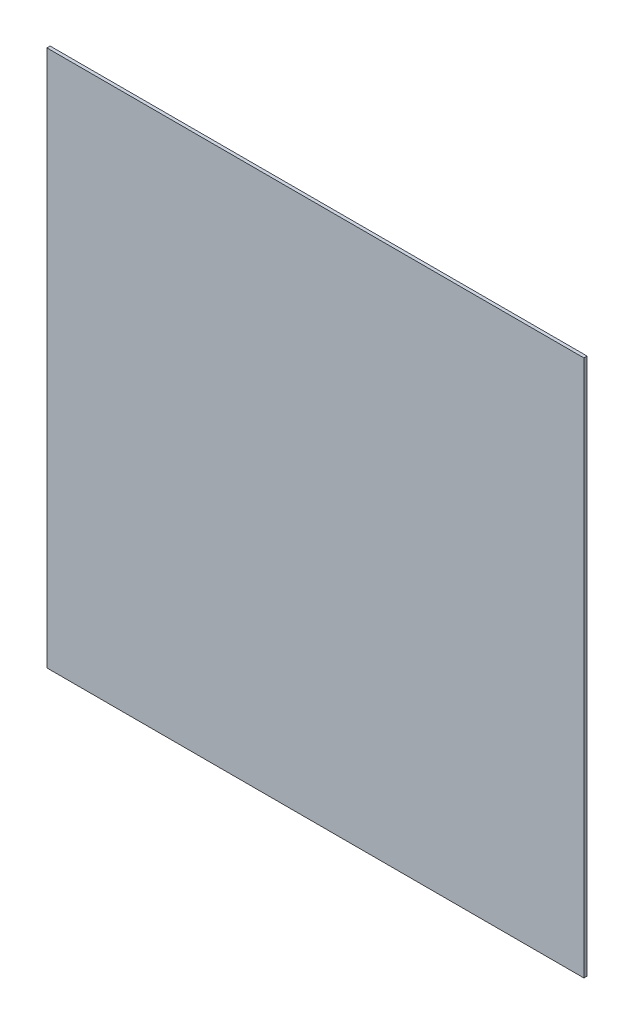
ISO-10303-21;
HEADER;
FILE_DESCRIPTION(('STEP AP214'),'2;1');
FILE_NAME('part.step','',(''),(''),'','','');
FILE_SCHEMA(('AUTOMOTIVE_DESIGN { 1 0 10303 214 1 1 1 1 }'));
ENDSEC;
DATA;
#1=APPLICATION_CONTEXT('core data for automotive mechanical design processes');
#2=APPLICATION_PROTOCOL_DEFINITION('international standard','automotive_design',2000,#1);
#3=PRODUCT_CONTEXT('',#1,'mechanical');
#4=PRODUCT('Part','Part','',(#3));
#5=PRODUCT_RELATED_PRODUCT_CATEGORY('part','',(#4));
#6=PRODUCT_DEFINITION_FORMATION('','',#4);
#7=PRODUCT_DEFINITION_CONTEXT('part definition',#1,'design');
#8=PRODUCT_DEFINITION('design','',#6,#7);
#9=PRODUCT_DEFINITION_SHAPE('','',#8);
#10=(LENGTH_UNIT() NAMED_UNIT(*) SI_UNIT(.MILLI.,.METRE.));
#11=(NAMED_UNIT(*) PLANE_ANGLE_UNIT() SI_UNIT($,.RADIAN.));
#12=(NAMED_UNIT(*) SI_UNIT($,.STERADIAN.) SOLID_ANGLE_UNIT());
#13=UNCERTAINTY_MEASURE_WITH_UNIT(LENGTH_MEASURE(1.E-05),#10,'distance_accuracy_value','');
#14=(GEOMETRIC_REPRESENTATION_CONTEXT(3) GLOBAL_UNCERTAINTY_ASSIGNED_CONTEXT((#13)) GLOBAL_UNIT_ASSIGNED_CONTEXT((#10,
#11,#12)) REPRESENTATION_CONTEXT('',''));
#15=CARTESIAN_POINT('',(0.,0.,0.));
#16=DIRECTION('',(0.,0.,1.));
#17=DIRECTION('',(1.,0.,0.));
#18=AXIS2_PLACEMENT_3D('',#15,#16,#17);
#19=CARTESIAN_POINT('',(250.,250.,3.));
#20=DIRECTION('',(-1.,0.,0.));
#21=DIRECTION('',(0.,0.,1.));
#22=AXIS2_PLACEMENT_3D('',#19,#20,#21);
#23=PLANE('',#22);
#24=DIRECTION('',(0.,1.,0.));
#25=VECTOR('',#24,1.);
#26=CARTESIAN_POINT('',(250.,250.,0.));
#27=LINE('',#26,#25);
#28=CARTESIAN_POINT('',(250.,-250.,0.));
#29=VERTEX_POINT('',#28);
#30=CARTESIAN_POINT('',(250.,250.,0.));
#31=VERTEX_POINT('',#30);
#32=EDGE_CURVE('E102',#29,#31,#27,.T.);
#33=ORIENTED_EDGE('',*,*,#32,.T.);
#34=DIRECTION('',(0.,0.,-1.));
#35=VECTOR('',#34,1.);
#36=CARTESIAN_POINT('',(250.,250.,3.));
#37=LINE('',#36,#35);
#38=CARTESIAN_POINT('',(250.,250.,3.));
#39=VERTEX_POINT('',#38);
#40=EDGE_CURVE('E11',#39,#31,#37,.T.);
#41=ORIENTED_EDGE('',*,*,#40,.F.);
#42=DIRECTION('',(0.,1.,0.));
#43=VECTOR('',#42,1.);
#44=CARTESIAN_POINT('',(250.,250.,3.));
#45=LINE('',#44,#43);
#46=CARTESIAN_POINT('',(250.,-250.,3.));
#47=VERTEX_POINT('',#46);
#48=EDGE_CURVE('E95',#47,#39,#45,.T.);
#49=ORIENTED_EDGE('',*,*,#48,.F.);
#50=DIRECTION('',(0.,0.,-1.));
#51=VECTOR('',#50,1.);
#52=CARTESIAN_POINT('',(250.,-250.,3.));
#53=LINE('',#52,#51);
#54=EDGE_CURVE('E99',#47,#29,#53,.T.);
#55=ORIENTED_EDGE('',*,*,#54,.T.);
#56=EDGE_LOOP('',(#33,#41,#49,#55));
#57=FACE_BOUND('',#56,.T.);
#58=ADVANCED_FACE('F41',(#57),#23,.F.);
#59=CARTESIAN_POINT('',(-250.,250.,3.));
#60=DIRECTION('',(0.,-1.,0.));
#61=DIRECTION('',(0.,0.,-1.));
#62=AXIS2_PLACEMENT_3D('',#59,#60,#61);
#63=PLANE('',#62);
#64=DIRECTION('',(-1.,0.,0.));
#65=VECTOR('',#64,1.);
#66=CARTESIAN_POINT('',(-250.,250.,0.));
#67=LINE('',#66,#65);
#68=CARTESIAN_POINT('',(-250.,250.,0.));
#69=VERTEX_POINT('',#68);
#70=EDGE_CURVE('E96',#31,#69,#67,.T.);
#71=ORIENTED_EDGE('',*,*,#70,.T.);
#72=DIRECTION('',(0.,0.,-1.));
#73=VECTOR('',#72,1.);
#74=CARTESIAN_POINT('',(-250.,250.,3.));
#75=LINE('',#74,#73);
#76=CARTESIAN_POINT('',(-250.,250.,3.));
#77=VERTEX_POINT('',#76);
#78=EDGE_CURVE('E47',#77,#69,#75,.T.);
#79=ORIENTED_EDGE('',*,*,#78,.F.);
#80=DIRECTION('',(-1.,0.,0.));
#81=VECTOR('',#80,1.);
#82=CARTESIAN_POINT('',(-250.,250.,3.));
#83=LINE('',#82,#81);
#84=EDGE_CURVE('E87',#39,#77,#83,.T.);
#85=ORIENTED_EDGE('',*,*,#84,.F.);
#86=ORIENTED_EDGE('',*,*,#40,.T.);
#87=EDGE_LOOP('',(#71,#79,#85,#86));
#88=FACE_BOUND('',#87,.T.);
#89=ADVANCED_FACE('F92',(#88),#63,.F.);
#90=CARTESIAN_POINT('',(-250.,250.,3.));
#91=DIRECTION('',(1.,0.,0.));
#92=DIRECTION('',(0.,0.,-1.));
#93=AXIS2_PLACEMENT_3D('',#90,#91,#92);
#94=PLANE('',#93);
#95=DIRECTION('',(0.,-1.,0.));
#96=VECTOR('',#95,1.);
#97=CARTESIAN_POINT('',(-250.,250.,0.));
#98=LINE('',#97,#96);
#99=CARTESIAN_POINT('',(-250.,-250.,0.));
#100=VERTEX_POINT('',#99);
#101=EDGE_CURVE('E74',#69,#100,#98,.T.);
#102=ORIENTED_EDGE('',*,*,#101,.T.);
#103=DIRECTION('',(0.,0.,-1.));
#104=VECTOR('',#103,1.);
#105=CARTESIAN_POINT('',(-250.,-250.,3.));
#106=LINE('',#105,#104);
#107=CARTESIAN_POINT('',(-250.,-250.,3.));
#108=VERTEX_POINT('',#107);
#109=EDGE_CURVE('E100',#108,#100,#106,.T.);
#110=ORIENTED_EDGE('',*,*,#109,.F.);
#111=DIRECTION('',(0.,-1.,0.));
#112=VECTOR('',#111,1.);
#113=CARTESIAN_POINT('',(-250.,250.,3.));
#114=LINE('',#113,#112);
#115=EDGE_CURVE('E89',#77,#108,#114,.T.);
#116=ORIENTED_EDGE('',*,*,#115,.F.);
#117=ORIENTED_EDGE('',*,*,#78,.T.);
#118=EDGE_LOOP('',(#102,#110,#116,#117));
#119=FACE_BOUND('',#118,.T.);
#120=ADVANCED_FACE('F98',(#119),#94,.F.);
#121=CARTESIAN_POINT('',(-250.,-250.,3.));
#122=DIRECTION('',(0.,1.,0.));
#123=DIRECTION('',(0.,0.,1.));
#124=AXIS2_PLACEMENT_3D('',#121,#122,#123);
#125=PLANE('',#124);
#126=DIRECTION('',(1.,0.,0.));
#127=VECTOR('',#126,1.);
#128=CARTESIAN_POINT('',(-250.,-250.,0.));
#129=LINE('',#128,#127);
#130=EDGE_CURVE('E79',#100,#29,#129,.T.);
#131=ORIENTED_EDGE('',*,*,#130,.T.);
#132=ORIENTED_EDGE('',*,*,#54,.F.);
#133=DIRECTION('',(1.,0.,0.));
#134=VECTOR('',#133,1.);
#135=CARTESIAN_POINT('',(-250.,-250.,3.));
#136=LINE('',#135,#134);
#137=EDGE_CURVE('E60',#108,#47,#136,.T.);
#138=ORIENTED_EDGE('',*,*,#137,.F.);
#139=ORIENTED_EDGE('',*,*,#109,.T.);
#140=EDGE_LOOP('',(#131,#132,#138,#139));
#141=FACE_BOUND('',#140,.T.);
#142=ADVANCED_FACE('F112',(#141),#125,.F.);
#143=CARTESIAN_POINT('',(0.,0.,3.));
#144=DIRECTION('',(0.,0.,1.));
#145=DIRECTION('',(1.,0.,0.));
#146=AXIS2_PLACEMENT_3D('',#143,#144,#145);
#147=PLANE('',#146);
#148=ORIENTED_EDGE('',*,*,#48,.T.);
#149=ORIENTED_EDGE('',*,*,#84,.T.);
#150=ORIENTED_EDGE('',*,*,#115,.T.);
#151=ORIENTED_EDGE('',*,*,#137,.T.);
#152=EDGE_LOOP('',(#148,#149,#150,#151));
#153=FACE_BOUND('',#152,.T.);
#154=ADVANCED_FACE('F86',(#153),#147,.T.);
#155=CARTESIAN_POINT('',(0.,0.,0.));
#156=DIRECTION('',(0.,0.,1.));
#157=DIRECTION('',(1.,0.,0.));
#158=AXIS2_PLACEMENT_3D('',#155,#156,#157);
#159=PLANE('',#158);
#160=ORIENTED_EDGE('',*,*,#32,.F.);
#161=ORIENTED_EDGE('',*,*,#130,.F.);
#162=ORIENTED_EDGE('',*,*,#101,.F.);
#163=ORIENTED_EDGE('',*,*,#70,.F.);
#164=EDGE_LOOP('',(#160,#161,#162,#163));
#165=FACE_BOUND('',#164,.T.);
#166=ADVANCED_FACE('F111',(#165),#159,.F.);
#167=CLOSED_SHELL('',(#58,#89,#120,#142,#154,#166));
#168=MANIFOLD_SOLID_BREP('B2',#167);
#169=ADVANCED_BREP_SHAPE_REPRESENTATION('',(#18,#168),#14);
#170=SHAPE_DEFINITION_REPRESENTATION(#9,#169);
ENDSEC;
END-ISO-10303-21;
